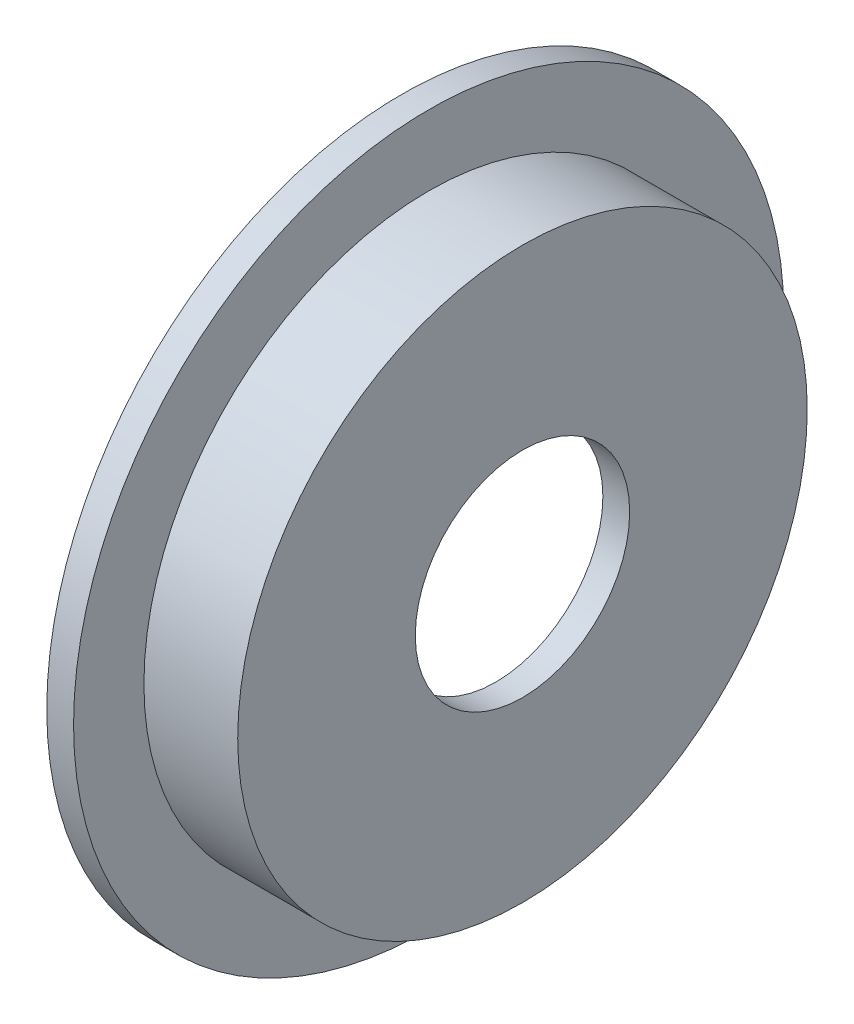
ISO-10303-21;
HEADER;
FILE_DESCRIPTION(('STEP AP214'),'2;1');
FILE_NAME('part.step','',(''),(''),'','','');
FILE_SCHEMA(('AUTOMOTIVE_DESIGN { 1 0 10303 214 1 1 1 1 }'));
ENDSEC;
DATA;
#1=APPLICATION_CONTEXT('core data for automotive mechanical design processes');
#2=APPLICATION_PROTOCOL_DEFINITION('international standard','automotive_design',2000,#1);
#3=PRODUCT_CONTEXT('',#1,'mechanical');
#4=PRODUCT('Part','Part','',(#3));
#5=PRODUCT_RELATED_PRODUCT_CATEGORY('part','',(#4));
#6=PRODUCT_DEFINITION_FORMATION('','',#4);
#7=PRODUCT_DEFINITION_CONTEXT('part definition',#1,'design');
#8=PRODUCT_DEFINITION('design','',#6,#7);
#9=PRODUCT_DEFINITION_SHAPE('','',#8);
#10=(LENGTH_UNIT() NAMED_UNIT(*) SI_UNIT(.MILLI.,.METRE.));
#11=(NAMED_UNIT(*) PLANE_ANGLE_UNIT() SI_UNIT($,.RADIAN.));
#12=(NAMED_UNIT(*) SI_UNIT($,.STERADIAN.) SOLID_ANGLE_UNIT());
#13=UNCERTAINTY_MEASURE_WITH_UNIT(LENGTH_MEASURE(1.E-05),#10,'distance_accuracy_value','');
#14=(GEOMETRIC_REPRESENTATION_CONTEXT(3) GLOBAL_UNCERTAINTY_ASSIGNED_CONTEXT((#13)) GLOBAL_UNIT_ASSIGNED_CONTEXT((#10,
#11,#12)) REPRESENTATION_CONTEXT('',''));
#15=CARTESIAN_POINT('',(0.,0.,0.));
#16=DIRECTION('',(0.,0.,1.));
#17=DIRECTION('',(1.,0.,0.));
#18=AXIS2_PLACEMENT_3D('',#15,#16,#17);
#19=CARTESIAN_POINT('',(0.,26.5,0.));
#20=DIRECTION('',(1.,0.,0.));
#21=DIRECTION('',(0.,0.,-1.));
#22=AXIS2_PLACEMENT_3D('',#19,#20,#21);
#23=PLANE('',#22);
#24=CARTESIAN_POINT('',(0.,0.,0.));
#25=DIRECTION('',(-1.,0.,0.));
#26=DIRECTION('',(0.,0.,1.));
#27=AXIS2_PLACEMENT_3D('',#24,#25,#26);
#28=CIRCLE('',#27,19.25);
#29=CARTESIAN_POINT('',(0.,0.,19.25));
#30=VERTEX_POINT('',#29);
#31=EDGE_CURVE('E10',#30,#30,#28,.T.);
#32=ORIENTED_EDGE('',*,*,#31,.F.);
#33=EDGE_LOOP('',(#32));
#34=FACE_BOUND('',#33,.T.);
#35=CARTESIAN_POINT('',(0.,0.,0.));
#36=DIRECTION('',(-1.,0.,0.));
#37=DIRECTION('',(0.,0.,1.));
#38=AXIS2_PLACEMENT_3D('',#35,#36,#37);
#39=CIRCLE('',#38,26.5);
#40=CARTESIAN_POINT('',(0.,0.,26.5));
#41=VERTEX_POINT('',#40);
#42=EDGE_CURVE('E72',#41,#41,#39,.T.);
#43=ORIENTED_EDGE('',*,*,#42,.T.);
#44=EDGE_LOOP('',(#43));
#45=FACE_BOUND('',#44,.T.);
#46=ADVANCED_FACE('F37',(#34,#45),#23,.F.);
#47=CARTESIAN_POINT('',(-17.5463624126376,0.,0.));
#48=DIRECTION('',(-1.,0.,0.));
#49=DIRECTION('',(0.,0.,1.));
#50=AXIS2_PLACEMENT_3D('',#47,#48,#49);
#51=CYLINDRICAL_SURFACE('',#50,19.25);
#52=CARTESIAN_POINT('',(7.,0.,0.));
#53=DIRECTION('',(-1.,0.,0.));
#54=DIRECTION('',(0.,0.,1.));
#55=AXIS2_PLACEMENT_3D('',#52,#53,#54);
#56=CIRCLE('',#55,19.25);
#57=CARTESIAN_POINT('',(7.,0.,19.25));
#58=VERTEX_POINT('',#57);
#59=EDGE_CURVE('E44',#58,#58,#56,.T.);
#60=ORIENTED_EDGE('',*,*,#59,.F.);
#61=EDGE_LOOP('',(#60));
#62=FACE_BOUND('',#61,.T.);
#63=ORIENTED_EDGE('',*,*,#31,.T.);
#64=EDGE_LOOP('',(#63));
#65=FACE_BOUND('',#64,.T.);
#66=ADVANCED_FACE('F110',(#62,#65),#51,.F.);
#67=CARTESIAN_POINT('',(7.,19.25,0.));
#68=DIRECTION('',(1.,0.,0.));
#69=DIRECTION('',(0.,0.,-1.));
#70=AXIS2_PLACEMENT_3D('',#67,#68,#69);
#71=PLANE('',#70);
#72=CARTESIAN_POINT('',(7.,0.,0.));
#73=DIRECTION('',(-1.,0.,0.));
#74=DIRECTION('',(0.,0.,1.));
#75=AXIS2_PLACEMENT_3D('',#72,#73,#74);
#76=CIRCLE('',#75,8.);
#77=CARTESIAN_POINT('',(7.,0.,8.));
#78=VERTEX_POINT('',#77);
#79=EDGE_CURVE('E49',#78,#78,#76,.T.);
#80=ORIENTED_EDGE('',*,*,#79,.F.);
#81=EDGE_LOOP('',(#80));
#82=FACE_BOUND('',#81,.T.);
#83=ORIENTED_EDGE('',*,*,#59,.T.);
#84=EDGE_LOOP('',(#83));
#85=FACE_BOUND('',#84,.T.);
#86=ADVANCED_FACE('F105',(#82,#85),#71,.F.);
#87=CARTESIAN_POINT('',(-17.5463624126376,0.,0.));
#88=DIRECTION('',(-1.,0.,0.));
#89=DIRECTION('',(0.,0.,1.));
#90=AXIS2_PLACEMENT_3D('',#87,#88,#89);
#91=CYLINDRICAL_SURFACE('',#90,8.);
#92=CARTESIAN_POINT('',(9.,0.,0.));
#93=DIRECTION('',(-1.,0.,0.));
#94=DIRECTION('',(0.,0.,1.));
#95=AXIS2_PLACEMENT_3D('',#92,#93,#94);
#96=CIRCLE('',#95,8.);
#97=CARTESIAN_POINT('',(9.,0.,8.));
#98=VERTEX_POINT('',#97);
#99=EDGE_CURVE('E54',#98,#98,#96,.T.);
#100=ORIENTED_EDGE('',*,*,#99,.F.);
#101=EDGE_LOOP('',(#100));
#102=FACE_BOUND('',#101,.T.);
#103=ORIENTED_EDGE('',*,*,#79,.T.);
#104=EDGE_LOOP('',(#103));
#105=FACE_BOUND('',#104,.T.);
#106=ADVANCED_FACE('F99',(#102,#105),#91,.F.);
#107=CARTESIAN_POINT('',(9.,21.25,0.));
#108=DIRECTION('',(-1.,0.,0.));
#109=DIRECTION('',(0.,0.,1.));
#110=AXIS2_PLACEMENT_3D('',#107,#108,#109);
#111=PLANE('',#110);
#112=CARTESIAN_POINT('',(9.,0.,0.));
#113=DIRECTION('',(-1.,0.,0.));
#114=DIRECTION('',(0.,0.,1.));
#115=AXIS2_PLACEMENT_3D('',#112,#113,#114);
#116=CIRCLE('',#115,21.25);
#117=CARTESIAN_POINT('',(9.,0.,21.25));
#118=VERTEX_POINT('',#117);
#119=EDGE_CURVE('E60',#118,#118,#116,.T.);
#120=ORIENTED_EDGE('',*,*,#119,.F.);
#121=EDGE_LOOP('',(#120));
#122=FACE_BOUND('',#121,.T.);
#123=ORIENTED_EDGE('',*,*,#99,.T.);
#124=EDGE_LOOP('',(#123));
#125=FACE_BOUND('',#124,.T.);
#126=ADVANCED_FACE('F93',(#122,#125),#111,.F.);
#127=CARTESIAN_POINT('',(-17.5463624126376,0.,0.));
#128=DIRECTION('',(-1.,0.,0.));
#129=DIRECTION('',(0.,0.,1.));
#130=AXIS2_PLACEMENT_3D('',#127,#128,#129);
#131=CYLINDRICAL_SURFACE('',#130,21.25);
#132=CARTESIAN_POINT('',(2.,0.,0.));
#133=DIRECTION('',(-1.,0.,0.));
#134=DIRECTION('',(0.,0.,1.));
#135=AXIS2_PLACEMENT_3D('',#132,#133,#134);
#136=CIRCLE('',#135,21.25);
#137=CARTESIAN_POINT('',(2.,0.,21.25));
#138=VERTEX_POINT('',#137);
#139=EDGE_CURVE('E64',#138,#138,#136,.T.);
#140=ORIENTED_EDGE('',*,*,#139,.F.);
#141=EDGE_LOOP('',(#140));
#142=FACE_BOUND('',#141,.T.);
#143=ORIENTED_EDGE('',*,*,#119,.T.);
#144=EDGE_LOOP('',(#143));
#145=FACE_BOUND('',#144,.T.);
#146=ADVANCED_FACE('F87',(#142,#145),#131,.T.);
#147=CARTESIAN_POINT('',(2.,26.5,0.));
#148=DIRECTION('',(-1.,0.,0.));
#149=DIRECTION('',(0.,0.,1.));
#150=AXIS2_PLACEMENT_3D('',#147,#148,#149);
#151=PLANE('',#150);
#152=CARTESIAN_POINT('',(2.,0.,0.));
#153=DIRECTION('',(-1.,0.,0.));
#154=DIRECTION('',(0.,0.,1.));
#155=AXIS2_PLACEMENT_3D('',#152,#153,#154);
#156=CIRCLE('',#155,26.5);
#157=CARTESIAN_POINT('',(2.,0.,26.5));
#158=VERTEX_POINT('',#157);
#159=EDGE_CURVE('E68',#158,#158,#156,.T.);
#160=ORIENTED_EDGE('',*,*,#159,.F.);
#161=EDGE_LOOP('',(#160));
#162=FACE_BOUND('',#161,.T.);
#163=ORIENTED_EDGE('',*,*,#139,.T.);
#164=EDGE_LOOP('',(#163));
#165=FACE_BOUND('',#164,.T.);
#166=ADVANCED_FACE('F81',(#162,#165),#151,.F.);
#167=CARTESIAN_POINT('',(-17.5463624126376,0.,0.));
#168=DIRECTION('',(-1.,0.,0.));
#169=DIRECTION('',(0.,0.,1.));
#170=AXIS2_PLACEMENT_3D('',#167,#168,#169);
#171=CYLINDRICAL_SURFACE('',#170,26.5);
#172=ORIENTED_EDGE('',*,*,#42,.F.);
#173=EDGE_LOOP('',(#172));
#174=FACE_BOUND('',#173,.T.);
#175=ORIENTED_EDGE('',*,*,#159,.T.);
#176=EDGE_LOOP('',(#175));
#177=FACE_BOUND('',#176,.T.);
#178=ADVANCED_FACE('F78',(#174,#177),#171,.T.);
#179=CLOSED_SHELL('',(#46,#66,#86,#106,#126,#146,#166,#178));
#180=MANIFOLD_SOLID_BREP('B2',#179);
#181=ADVANCED_BREP_SHAPE_REPRESENTATION('',(#18,#180),#14);
#182=SHAPE_DEFINITION_REPRESENTATION(#9,#181);
ENDSEC;
END-ISO-10303-21;
